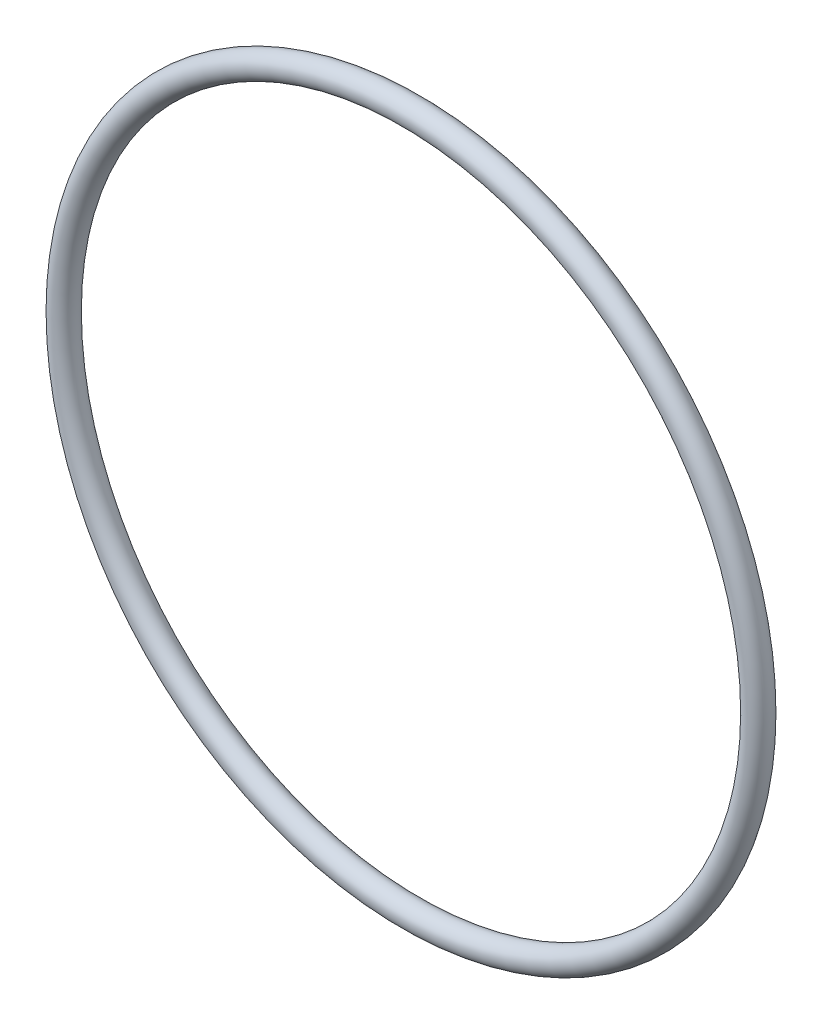
ISO-10303-21;
HEADER;
FILE_DESCRIPTION(('STEP AP214'),'2;1');
FILE_NAME('part.step','',(''),(''),'','','');
FILE_SCHEMA(('AUTOMOTIVE_DESIGN { 1 0 10303 214 1 1 1 1 }'));
ENDSEC;
DATA;
#1=APPLICATION_CONTEXT('core data for automotive mechanical design processes');
#2=APPLICATION_PROTOCOL_DEFINITION('international standard','automotive_design',2000,#1);
#3=PRODUCT_CONTEXT('',#1,'mechanical');
#4=PRODUCT('Part','Part','',(#3));
#5=PRODUCT_RELATED_PRODUCT_CATEGORY('part','',(#4));
#6=PRODUCT_DEFINITION_FORMATION('','',#4);
#7=PRODUCT_DEFINITION_CONTEXT('part definition',#1,'design');
#8=PRODUCT_DEFINITION('design','',#6,#7);
#9=PRODUCT_DEFINITION_SHAPE('','',#8);
#10=(LENGTH_UNIT() NAMED_UNIT(*) SI_UNIT(.MILLI.,.METRE.));
#11=(NAMED_UNIT(*) PLANE_ANGLE_UNIT() SI_UNIT($,.RADIAN.));
#12=(NAMED_UNIT(*) SI_UNIT($,.STERADIAN.) SOLID_ANGLE_UNIT());
#13=UNCERTAINTY_MEASURE_WITH_UNIT(LENGTH_MEASURE(1.E-05),#10,'distance_accuracy_value','');
#14=(GEOMETRIC_REPRESENTATION_CONTEXT(3) GLOBAL_UNCERTAINTY_ASSIGNED_CONTEXT((#13)) GLOBAL_UNIT_ASSIGNED_CONTEXT((#10,
#11,#12)) REPRESENTATION_CONTEXT('',''));
#15=CARTESIAN_POINT('',(0.,0.,0.));
#16=DIRECTION('',(0.,0.,1.));
#17=DIRECTION('',(1.,0.,0.));
#18=AXIS2_PLACEMENT_3D('',#15,#16,#17);
#19=CARTESIAN_POINT('',(0.,0.,0.));
#20=DIRECTION('',(0.,0.,1.));
#21=DIRECTION('',(1.,0.,0.));
#22=AXIS2_PLACEMENT_3D('',#19,#20,#21);
#23=TOROIDAL_SURFACE('',#22,34.75,1.25);
#24=CARTESIAN_POINT('',(36.,0.,0.));
#25=VERTEX_POINT('',#24);
#26=VERTEX_LOOP('',#25);
#27=FACE_BOUND('',#26,.T.);
#28=ADVANCED_FACE('F35',(#27),#23,.T.);
#29=CLOSED_SHELL('',(#28));
#30=MANIFOLD_SOLID_BREP('B2',#29);
#31=ADVANCED_BREP_SHAPE_REPRESENTATION('',(#18,#30),#14);
#32=SHAPE_DEFINITION_REPRESENTATION(#9,#31);
ENDSEC;
END-ISO-10303-21;
